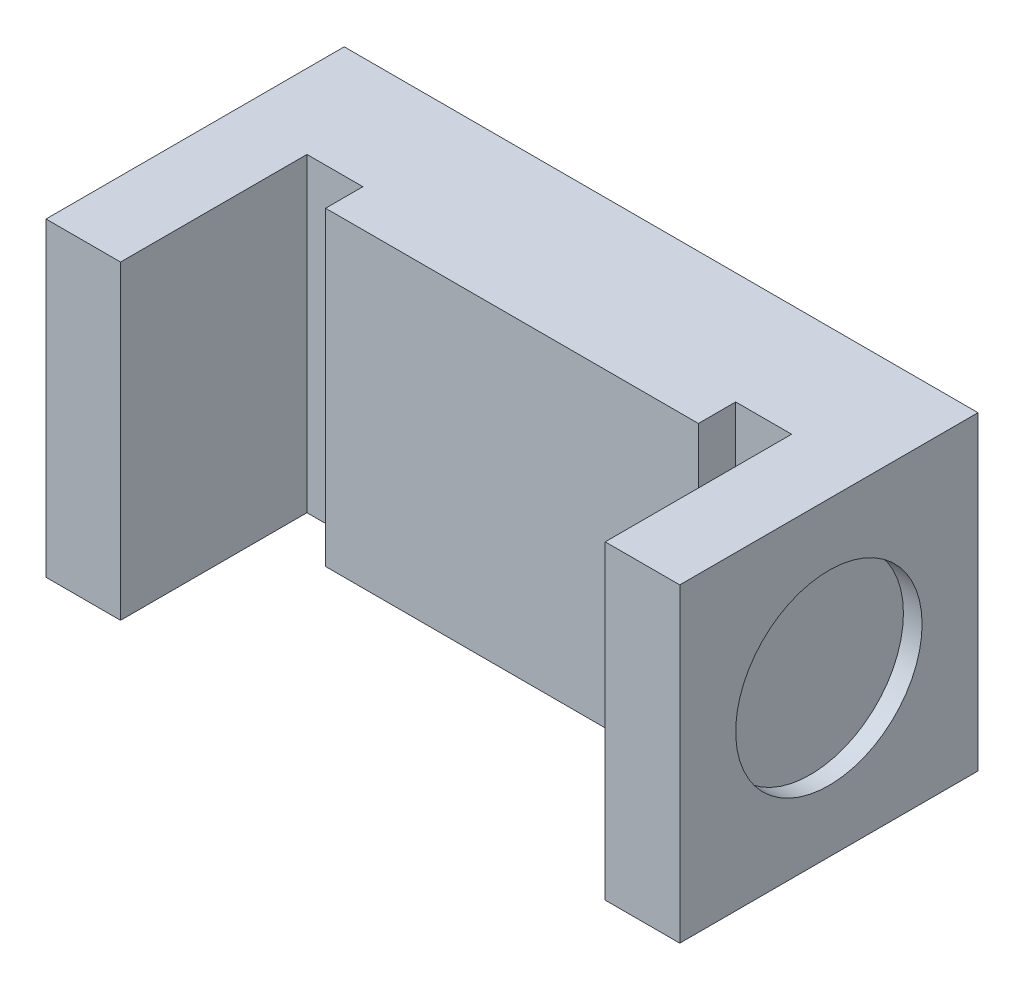
ISO-10303-21;
HEADER;
FILE_DESCRIPTION(('STEP AP214'),'2;1');
FILE_NAME('part.step','',(''),(''),'','','');
FILE_SCHEMA(('AUTOMOTIVE_DESIGN { 1 0 10303 214 1 1 1 1 }'));
ENDSEC;
DATA;
#1=APPLICATION_CONTEXT('core data for automotive mechanical design processes');
#2=APPLICATION_PROTOCOL_DEFINITION('international standard','automotive_design',2000,#1);
#3=PRODUCT_CONTEXT('',#1,'mechanical');
#4=PRODUCT('Part','Part','',(#3));
#5=PRODUCT_RELATED_PRODUCT_CATEGORY('part','',(#4));
#6=PRODUCT_DEFINITION_FORMATION('','',#4);
#7=PRODUCT_DEFINITION_CONTEXT('part definition',#1,'design');
#8=PRODUCT_DEFINITION('design','',#6,#7);
#9=PRODUCT_DEFINITION_SHAPE('','',#8);
#10=(LENGTH_UNIT() NAMED_UNIT(*) SI_UNIT(.MILLI.,.METRE.));
#11=(NAMED_UNIT(*) PLANE_ANGLE_UNIT() SI_UNIT($,.RADIAN.));
#12=(NAMED_UNIT(*) SI_UNIT($,.STERADIAN.) SOLID_ANGLE_UNIT());
#13=UNCERTAINTY_MEASURE_WITH_UNIT(LENGTH_MEASURE(1.E-05),#10,'distance_accuracy_value','');
#14=(GEOMETRIC_REPRESENTATION_CONTEXT(3) GLOBAL_UNCERTAINTY_ASSIGNED_CONTEXT((#13)) GLOBAL_UNIT_ASSIGNED_CONTEXT((#10,
#11,#12)) REPRESENTATION_CONTEXT('',''));
#15=CARTESIAN_POINT('',(0.,0.,0.));
#16=DIRECTION('',(0.,0.,1.));
#17=DIRECTION('',(1.,0.,0.));
#18=AXIS2_PLACEMENT_3D('',#15,#16,#17);
#19=CARTESIAN_POINT('',(42.5,25.,-30.));
#20=DIRECTION('',(0.,-1.,0.));
#21=DIRECTION('',(0.,0.,-1.));
#22=AXIS2_PLACEMENT_3D('',#19,#20,#21);
#23=PLANE('',#22);
#24=DIRECTION('',(1.,0.,0.));
#25=VECTOR('',#24,1.);
#26=CARTESIAN_POINT('',(42.5,25.,-15.));
#27=LINE('',#26,#25);
#28=CARTESIAN_POINT('',(-42.5,25.,-15.));
#29=VERTEX_POINT('',#28);
#30=CARTESIAN_POINT('',(42.5,25.,-15.));
#31=VERTEX_POINT('',#30);
#32=EDGE_CURVE('E231',#29,#31,#27,.T.);
#33=ORIENTED_EDGE('',*,*,#32,.F.);
#34=DIRECTION('',(0.,0.,1.));
#35=VECTOR('',#34,1.);
#36=CARTESIAN_POINT('',(-42.5,25.,-30.));
#37=LINE('',#36,#35);
#38=CARTESIAN_POINT('',(-42.5,25.,0.));
#39=VERTEX_POINT('',#38);
#40=EDGE_CURVE('E59',#29,#39,#37,.T.);
#41=ORIENTED_EDGE('',*,*,#40,.T.);
#42=DIRECTION('',(1.,0.,0.));
#43=VECTOR('',#42,1.);
#44=CARTESIAN_POINT('',(42.5,25.,0.));
#45=LINE('',#44,#43);
#46=CARTESIAN_POINT('',(42.5,25.,0.));
#47=VERTEX_POINT('',#46);
#48=EDGE_CURVE('E246',#39,#47,#45,.T.);
#49=ORIENTED_EDGE('',*,*,#48,.T.);
#50=DIRECTION('',(0.,0.,1.));
#51=VECTOR('',#50,1.);
#52=CARTESIAN_POINT('',(42.5,25.,-30.));
#53=LINE('',#52,#51);
#54=EDGE_CURVE('E256',#31,#47,#53,.T.);
#55=ORIENTED_EDGE('',*,*,#54,.F.);
#56=EDGE_LOOP('',(#33,#41,#49,#55));
#57=FACE_BOUND('',#56,.T.);
#58=ADVANCED_FACE('F33',(#57),#23,.F.);
#59=CARTESIAN_POINT('',(0.,0.,0.));
#60=DIRECTION('',(0.,0.,1.));
#61=DIRECTION('',(1.,0.,0.));
#62=AXIS2_PLACEMENT_3D('',#59,#60,#61);
#63=PLANE('',#62);
#64=DIRECTION('',(0.,1.,0.));
#65=VECTOR('',#64,1.);
#66=CARTESIAN_POINT('',(-40.,-31.6191983122362,0.));
#67=LINE('',#66,#65);
#68=CARTESIAN_POINT('',(-40.,-41.6191983122363,0.));
#69=VERTEX_POINT('',#68);
#70=CARTESIAN_POINT('',(-40.,-31.6191983122362,0.));
#71=VERTEX_POINT('',#70);
#72=EDGE_CURVE('E11',#69,#71,#67,.T.);
#73=ORIENTED_EDGE('',*,*,#72,.F.);
#74=DIRECTION('',(1.,0.,0.));
#75=VECTOR('',#74,1.);
#76=CARTESIAN_POINT('',(-65.,-41.6191983122363,0.));
#77=LINE('',#76,#75);
#78=CARTESIAN_POINT('',(-85.,-41.6191983122363,0.));
#79=VERTEX_POINT('',#78);
#80=EDGE_CURVE('E37',#79,#69,#77,.T.);
#81=ORIENTED_EDGE('',*,*,#80,.F.);
#82=DIRECTION('',(0.,-1.,0.));
#83=VECTOR('',#82,1.);
#84=CARTESIAN_POINT('',(-85.,41.6191983122363,0.));
#85=LINE('',#84,#83);
#86=CARTESIAN_POINT('',(-85.,41.6191983122363,0.));
#87=VERTEX_POINT('',#86);
#88=EDGE_CURVE('E326',#87,#79,#85,.T.);
#89=ORIENTED_EDGE('',*,*,#88,.F.);
#90=DIRECTION('',(-1.,0.,0.));
#91=VECTOR('',#90,1.);
#92=CARTESIAN_POINT('',(-65.,41.6191983122363,0.));
#93=LINE('',#92,#91);
#94=CARTESIAN_POINT('',(85.,41.6191983122363,0.));
#95=VERTEX_POINT('',#94);
#96=EDGE_CURVE('E375',#95,#87,#93,.T.);
#97=ORIENTED_EDGE('',*,*,#96,.F.);
#98=DIRECTION('',(0.,1.,0.));
#99=VECTOR('',#98,1.);
#100=CARTESIAN_POINT('',(85.,41.6191983122363,0.));
#101=LINE('',#100,#99);
#102=CARTESIAN_POINT('',(85.,-41.6191983122363,0.));
#103=VERTEX_POINT('',#102);
#104=EDGE_CURVE('E297',#103,#95,#101,.T.);
#105=ORIENTED_EDGE('',*,*,#104,.F.);
#106=CARTESIAN_POINT('',(40.,-41.6191983122363,0.));
#107=VERTEX_POINT('',#106);
#108=EDGE_CURVE('E386',#107,#103,#77,.T.);
#109=ORIENTED_EDGE('',*,*,#108,.F.);
#110=DIRECTION('',(0.,-1.,0.));
#111=VECTOR('',#110,1.);
#112=CARTESIAN_POINT('',(40.,-31.6191983122362,0.));
#113=LINE('',#112,#111);
#114=CARTESIAN_POINT('',(40.,-31.6191983122362,0.));
#115=VERTEX_POINT('',#114);
#116=EDGE_CURVE('E275',#115,#107,#113,.T.);
#117=ORIENTED_EDGE('',*,*,#116,.F.);
#118=DIRECTION('',(1.,0.,0.));
#119=VECTOR('',#118,1.);
#120=CARTESIAN_POINT('',(40.,-31.6191983122362,0.));
#121=LINE('',#120,#119);
#122=EDGE_CURVE('E271',#71,#115,#121,.T.);
#123=ORIENTED_EDGE('',*,*,#122,.F.);
#124=EDGE_LOOP('',(#73,#81,#89,#97,#105,#109,#117,#123));
#125=FACE_BOUND('',#124,.T.);
#126=DIRECTION('',(0.,1.,0.));
#127=VECTOR('',#126,1.);
#128=CARTESIAN_POINT('',(-42.5,25.,0.));
#129=LINE('',#128,#127);
#130=CARTESIAN_POINT('',(-42.5,-25.,0.));
#131=VERTEX_POINT('',#130);
#132=EDGE_CURVE('E237',#131,#39,#129,.T.);
#133=ORIENTED_EDGE('',*,*,#132,.F.);
#134=DIRECTION('',(-1.,0.,0.));
#135=VECTOR('',#134,1.);
#136=CARTESIAN_POINT('',(42.5,-25.,0.));
#137=LINE('',#136,#135);
#138=CARTESIAN_POINT('',(42.5,-25.,0.));
#139=VERTEX_POINT('',#138);
#140=EDGE_CURVE('E243',#139,#131,#137,.T.);
#141=ORIENTED_EDGE('',*,*,#140,.F.);
#142=DIRECTION('',(0.,-1.,0.));
#143=VECTOR('',#142,1.);
#144=CARTESIAN_POINT('',(42.5,25.,0.));
#145=LINE('',#144,#143);
#146=EDGE_CURVE('E248',#47,#139,#145,.T.);
#147=ORIENTED_EDGE('',*,*,#146,.F.);
#148=ORIENTED_EDGE('',*,*,#48,.F.);
#149=EDGE_LOOP('',(#133,#141,#147,#148));
#150=FACE_BOUND('',#149,.T.);
#151=ADVANCED_FACE('F419',(#125,#150),#63,.F.);
#152=CARTESIAN_POINT('',(0.,0.,30.));
#153=DIRECTION('',(0.,0.,1.));
#154=DIRECTION('',(1.,0.,0.));
#155=AXIS2_PLACEMENT_3D('',#152,#153,#154);
#156=PLANE('',#155);
#157=DIRECTION('',(0.,1.,0.));
#158=VECTOR('',#157,1.);
#159=CARTESIAN_POINT('',(50.,41.6191983122363,30.));
#160=LINE('',#159,#158);
#161=CARTESIAN_POINT('',(50.,-41.6191983122363,30.));
#162=VERTEX_POINT('',#161);
#163=CARTESIAN_POINT('',(50.,41.6191983122363,30.));
#164=VERTEX_POINT('',#163);
#165=EDGE_CURVE('E348',#162,#164,#160,.T.);
#166=ORIENTED_EDGE('',*,*,#165,.F.);
#167=DIRECTION('',(1.,0.,0.));
#168=VECTOR('',#167,1.);
#169=CARTESIAN_POINT('',(-65.,-41.6191983122363,30.));
#170=LINE('',#169,#168);
#171=CARTESIAN_POINT('',(65.,-41.6191983122363,30.));
#172=VERTEX_POINT('',#171);
#173=EDGE_CURVE('E385',#162,#172,#170,.T.);
#174=ORIENTED_EDGE('',*,*,#173,.T.);
#175=DIRECTION('',(0.,1.,0.));
#176=VECTOR('',#175,1.);
#177=CARTESIAN_POINT('',(65.,41.6191983122363,30.));
#178=LINE('',#177,#176);
#179=CARTESIAN_POINT('',(65.,41.6191983122363,30.));
#180=VERTEX_POINT('',#179);
#181=EDGE_CURVE('E376',#172,#180,#178,.T.);
#182=ORIENTED_EDGE('',*,*,#181,.T.);
#183=DIRECTION('',(-1.,0.,0.));
#184=VECTOR('',#183,1.);
#185=CARTESIAN_POINT('',(-65.,41.6191983122363,30.));
#186=LINE('',#185,#184);
#187=EDGE_CURVE('E380',#180,#164,#186,.T.);
#188=ORIENTED_EDGE('',*,*,#187,.T.);
#189=EDGE_LOOP('',(#166,#174,#182,#188));
#190=FACE_BOUND('',#189,.T.);
#191=ADVANCED_FACE('F441',(#190),#156,.T.);
#192=CARTESIAN_POINT('',(-65.,41.6191983122363,30.));
#193=DIRECTION('',(0.,-1.,0.));
#194=DIRECTION('',(0.,0.,-1.));
#195=AXIS2_PLACEMENT_3D('',#192,#193,#194);
#196=PLANE('',#195);
#197=ORIENTED_EDGE('',*,*,#96,.T.);
#198=DIRECTION('',(0.,0.,-1.));
#199=VECTOR('',#198,1.);
#200=CARTESIAN_POINT('',(-85.,41.6191983122363,0.));
#201=LINE('',#200,#199);
#202=CARTESIAN_POINT('',(-85.,41.6191983122363,80.));
#203=VERTEX_POINT('',#202);
#204=EDGE_CURVE('E334',#203,#87,#201,.T.);
#205=ORIENTED_EDGE('',*,*,#204,.F.);
#206=DIRECTION('',(1.,0.,0.));
#207=VECTOR('',#206,1.);
#208=CARTESIAN_POINT('',(-85.,41.6191983122363,80.));
#209=LINE('',#208,#207);
#210=CARTESIAN_POINT('',(-65.,41.6191983122363,80.));
#211=VERTEX_POINT('',#210);
#212=EDGE_CURVE('E337',#203,#211,#209,.T.);
#213=ORIENTED_EDGE('',*,*,#212,.T.);
#214=DIRECTION('',(0.,0.,-1.));
#215=VECTOR('',#214,1.);
#216=CARTESIAN_POINT('',(-65.,41.6191983122363,0.));
#217=LINE('',#216,#215);
#218=CARTESIAN_POINT('',(-65.,41.6191983122363,30.));
#219=VERTEX_POINT('',#218);
#220=EDGE_CURVE('E330',#211,#219,#217,.T.);
#221=ORIENTED_EDGE('',*,*,#220,.T.);
#222=CARTESIAN_POINT('',(-50.,41.6191983122363,30.));
#223=VERTEX_POINT('',#222);
#224=EDGE_CURVE('E379',#223,#219,#186,.T.);
#225=ORIENTED_EDGE('',*,*,#224,.F.);
#226=DIRECTION('',(0.,0.,-1.));
#227=VECTOR('',#226,1.);
#228=CARTESIAN_POINT('',(-50.,41.6191983122363,40.));
#229=LINE('',#228,#227);
#230=CARTESIAN_POINT('',(-50.,41.6191983122363,40.));
#231=VERTEX_POINT('',#230);
#232=EDGE_CURVE('E369',#231,#223,#229,.T.);
#233=ORIENTED_EDGE('',*,*,#232,.F.);
#234=DIRECTION('',(-1.,0.,0.));
#235=VECTOR('',#234,1.);
#236=CARTESIAN_POINT('',(-50.,41.6191983122363,40.));
#237=LINE('',#236,#235);
#238=CARTESIAN_POINT('',(50.,41.6191983122363,40.));
#239=VERTEX_POINT('',#238);
#240=EDGE_CURVE('E352',#239,#231,#237,.T.);
#241=ORIENTED_EDGE('',*,*,#240,.F.);
#242=DIRECTION('',(0.,0.,-1.));
#243=VECTOR('',#242,1.);
#244=CARTESIAN_POINT('',(50.,41.6191983122363,40.));
#245=LINE('',#244,#243);
#246=EDGE_CURVE('E372',#239,#164,#245,.T.);
#247=ORIENTED_EDGE('',*,*,#246,.T.);
#248=ORIENTED_EDGE('',*,*,#187,.F.);
#249=DIRECTION('',(0.,0.,1.));
#250=VECTOR('',#249,1.);
#251=CARTESIAN_POINT('',(65.,41.6191983122363,0.));
#252=LINE('',#251,#250);
#253=CARTESIAN_POINT('',(65.,41.6191983122363,80.));
#254=VERTEX_POINT('',#253);
#255=EDGE_CURVE('E294',#180,#254,#252,.T.);
#256=ORIENTED_EDGE('',*,*,#255,.T.);
#257=DIRECTION('',(-1.,0.,0.));
#258=VECTOR('',#257,1.);
#259=CARTESIAN_POINT('',(85.,41.6191983122363,80.));
#260=LINE('',#259,#258);
#261=CARTESIAN_POINT('',(85.,41.6191983122363,80.));
#262=VERTEX_POINT('',#261);
#263=EDGE_CURVE('E316',#262,#254,#260,.T.);
#264=ORIENTED_EDGE('',*,*,#263,.F.);
#265=DIRECTION('',(0.,0.,1.));
#266=VECTOR('',#265,1.);
#267=CARTESIAN_POINT('',(85.,41.6191983122363,0.));
#268=LINE('',#267,#266);
#269=EDGE_CURVE('E300',#95,#262,#268,.T.);
#270=ORIENTED_EDGE('',*,*,#269,.F.);
#271=EDGE_LOOP('',(#197,#205,#213,#221,#225,#233,#241,#247,#248,#256,#264,#270));
#272=FACE_BOUND('',#271,.T.);
#273=ADVANCED_FACE('F35',(#272),#196,.F.);
#274=CARTESIAN_POINT('',(-65.,-41.6191983122363,30.));
#275=DIRECTION('',(0.,1.,0.));
#276=DIRECTION('',(0.,0.,1.));
#277=AXIS2_PLACEMENT_3D('',#274,#275,#276);
#278=PLANE('',#277);
#279=ORIENTED_EDGE('',*,*,#80,.T.);
#280=EDGE_CURVE('E390',#69,#107,#77,.T.);
#281=ORIENTED_EDGE('',*,*,#280,.T.);
#282=ORIENTED_EDGE('',*,*,#108,.T.);
#283=DIRECTION('',(0.,0.,-1.));
#284=VECTOR('',#283,1.);
#285=CARTESIAN_POINT('',(85.,-41.6191983122363,0.));
#286=LINE('',#285,#284);
#287=CARTESIAN_POINT('',(85.,-41.6191983122363,80.));
#288=VERTEX_POINT('',#287);
#289=EDGE_CURVE('E305',#288,#103,#286,.T.);
#290=ORIENTED_EDGE('',*,*,#289,.F.);
#291=DIRECTION('',(-1.,0.,0.));
#292=VECTOR('',#291,1.);
#293=CARTESIAN_POINT('',(85.,-41.6191983122363,80.));
#294=LINE('',#293,#292);
#295=CARTESIAN_POINT('',(65.,-41.6191983122363,80.));
#296=VERTEX_POINT('',#295);
#297=EDGE_CURVE('E308',#288,#296,#294,.T.);
#298=ORIENTED_EDGE('',*,*,#297,.T.);
#299=DIRECTION('',(0.,0.,-1.));
#300=VECTOR('',#299,1.);
#301=CARTESIAN_POINT('',(65.,-41.6191983122363,0.));
#302=LINE('',#301,#300);
#303=EDGE_CURVE('E301',#296,#172,#302,.T.);
#304=ORIENTED_EDGE('',*,*,#303,.T.);
#305=ORIENTED_EDGE('',*,*,#173,.F.);
#306=DIRECTION('',(0.,0.,-1.));
#307=VECTOR('',#306,1.);
#308=CARTESIAN_POINT('',(50.,-41.6191983122363,40.));
#309=LINE('',#308,#307);
#310=CARTESIAN_POINT('',(50.,-41.6191983122363,40.));
#311=VERTEX_POINT('',#310);
#312=EDGE_CURVE('E359',#311,#162,#309,.T.);
#313=ORIENTED_EDGE('',*,*,#312,.F.);
#314=DIRECTION('',(1.,0.,0.));
#315=VECTOR('',#314,1.);
#316=CARTESIAN_POINT('',(-50.,-41.6191983122363,40.));
#317=LINE('',#316,#315);
#318=CARTESIAN_POINT('',(-50.,-41.6191983122363,40.));
#319=VERTEX_POINT('',#318);
#320=EDGE_CURVE('E357',#319,#311,#317,.T.);
#321=ORIENTED_EDGE('',*,*,#320,.F.);
#322=DIRECTION('',(0.,0.,-1.));
#323=VECTOR('',#322,1.);
#324=CARTESIAN_POINT('',(-50.,-41.6191983122363,40.));
#325=LINE('',#324,#323);
#326=CARTESIAN_POINT('',(-50.,-41.6191983122363,30.));
#327=VERTEX_POINT('',#326);
#328=EDGE_CURVE('E366',#319,#327,#325,.T.);
#329=ORIENTED_EDGE('',*,*,#328,.T.);
#330=CARTESIAN_POINT('',(-65.,-41.6191983122363,30.));
#331=VERTEX_POINT('',#330);
#332=EDGE_CURVE('E42',#331,#327,#170,.T.);
#333=ORIENTED_EDGE('',*,*,#332,.F.);
#334=DIRECTION('',(0.,0.,1.));
#335=VECTOR('',#334,1.);
#336=CARTESIAN_POINT('',(-65.,-41.6191983122363,0.));
#337=LINE('',#336,#335);
#338=CARTESIAN_POINT('',(-65.,-41.6191983122363,80.));
#339=VERTEX_POINT('',#338);
#340=EDGE_CURVE('E323',#331,#339,#337,.T.);
#341=ORIENTED_EDGE('',*,*,#340,.T.);
#342=DIRECTION('',(1.,0.,0.));
#343=VECTOR('',#342,1.);
#344=CARTESIAN_POINT('',(-85.,-41.6191983122363,80.));
#345=LINE('',#344,#343);
#346=CARTESIAN_POINT('',(-85.,-41.6191983122363,80.));
#347=VERTEX_POINT('',#346);
#348=EDGE_CURVE('E345',#347,#339,#345,.T.);
#349=ORIENTED_EDGE('',*,*,#348,.F.);
#350=DIRECTION('',(0.,0.,1.));
#351=VECTOR('',#350,1.);
#352=CARTESIAN_POINT('',(-85.,-41.6191983122363,0.));
#353=LINE('',#352,#351);
#354=EDGE_CURVE('E329',#79,#347,#353,.T.);
#355=ORIENTED_EDGE('',*,*,#354,.F.);
#356=EDGE_LOOP('',(#279,#281,#282,#290,#298,#304,#305,#313,#321,#329,#333,#341,#349,#355));
#357=FACE_BOUND('',#356,.T.);
#358=ADVANCED_FACE('F397',(#357),#278,.F.);
#359=DIRECTION('',(0.,-1.,0.));
#360=VECTOR('',#359,1.);
#361=CARTESIAN_POINT('',(-50.,41.6191983122363,30.));
#362=LINE('',#361,#360);
#363=EDGE_CURVE('E353',#223,#327,#362,.T.);
#364=ORIENTED_EDGE('',*,*,#363,.F.);
#365=ORIENTED_EDGE('',*,*,#224,.T.);
#366=DIRECTION('',(0.,-1.,0.));
#367=VECTOR('',#366,1.);
#368=CARTESIAN_POINT('',(-65.,41.6191983122363,30.));
#369=LINE('',#368,#367);
#370=EDGE_CURVE('E382',#219,#331,#369,.T.);
#371=ORIENTED_EDGE('',*,*,#370,.T.);
#372=ORIENTED_EDGE('',*,*,#332,.T.);
#373=EDGE_LOOP('',(#364,#365,#371,#372));
#374=FACE_BOUND('',#373,.T.);
#375=ADVANCED_FACE('F605',(#374),#156,.T.);
#376=CARTESIAN_POINT('',(50.,41.6191983122363,40.));
#377=DIRECTION('',(-1.,0.,0.));
#378=DIRECTION('',(0.,0.,1.));
#379=AXIS2_PLACEMENT_3D('',#376,#377,#378);
#380=PLANE('',#379);
#381=ORIENTED_EDGE('',*,*,#165,.T.);
#382=ORIENTED_EDGE('',*,*,#246,.F.);
#383=DIRECTION('',(0.,1.,0.));
#384=VECTOR('',#383,1.);
#385=CARTESIAN_POINT('',(50.,41.6191983122363,40.));
#386=LINE('',#385,#384);
#387=EDGE_CURVE('E349',#311,#239,#386,.T.);
#388=ORIENTED_EDGE('',*,*,#387,.F.);
#389=ORIENTED_EDGE('',*,*,#312,.T.);
#390=EDGE_LOOP('',(#381,#382,#388,#389));
#391=FACE_BOUND('',#390,.T.);
#392=ADVANCED_FACE('F730',(#391),#380,.F.);
#393=CARTESIAN_POINT('',(-50.,41.6191983122363,40.));
#394=DIRECTION('',(1.,0.,0.));
#395=DIRECTION('',(0.,0.,-1.));
#396=AXIS2_PLACEMENT_3D('',#393,#394,#395);
#397=PLANE('',#396);
#398=ORIENTED_EDGE('',*,*,#363,.T.);
#399=ORIENTED_EDGE('',*,*,#328,.F.);
#400=DIRECTION('',(0.,-1.,0.));
#401=VECTOR('',#400,1.);
#402=CARTESIAN_POINT('',(-50.,41.6191983122363,40.));
#403=LINE('',#402,#401);
#404=EDGE_CURVE('E355',#231,#319,#403,.T.);
#405=ORIENTED_EDGE('',*,*,#404,.F.);
#406=ORIENTED_EDGE('',*,*,#232,.T.);
#407=EDGE_LOOP('',(#398,#399,#405,#406));
#408=FACE_BOUND('',#407,.T.);
#409=ADVANCED_FACE('F740',(#408),#397,.F.);
#410=CARTESIAN_POINT('',(0.,0.,40.));
#411=DIRECTION('',(0.,0.,1.));
#412=DIRECTION('',(1.,0.,0.));
#413=AXIS2_PLACEMENT_3D('',#410,#411,#412);
#414=PLANE('',#413);
#415=ORIENTED_EDGE('',*,*,#387,.T.);
#416=ORIENTED_EDGE('',*,*,#240,.T.);
#417=ORIENTED_EDGE('',*,*,#404,.T.);
#418=ORIENTED_EDGE('',*,*,#320,.T.);
#419=EDGE_LOOP('',(#415,#416,#417,#418));
#420=FACE_BOUND('',#419,.T.);
#421=ADVANCED_FACE('F721',(#420),#414,.T.);
#422=CARTESIAN_POINT('',(-85.,41.6191983122363,80.));
#423=DIRECTION('',(0.,0.,-1.));
#424=DIRECTION('',(-1.,0.,0.));
#425=AXIS2_PLACEMENT_3D('',#422,#423,#424);
#426=PLANE('',#425);
#427=DIRECTION('',(0.,1.,0.));
#428=VECTOR('',#427,1.);
#429=CARTESIAN_POINT('',(-65.,41.6191983122363,80.));
#430=LINE('',#429,#428);
#431=EDGE_CURVE('E339',#339,#211,#430,.T.);
#432=ORIENTED_EDGE('',*,*,#431,.T.);
#433=ORIENTED_EDGE('',*,*,#212,.F.);
#434=DIRECTION('',(0.,1.,0.));
#435=VECTOR('',#434,1.);
#436=CARTESIAN_POINT('',(-85.,41.6191983122363,80.));
#437=LINE('',#436,#435);
#438=EDGE_CURVE('E332',#347,#203,#437,.T.);
#439=ORIENTED_EDGE('',*,*,#438,.F.);
#440=ORIENTED_EDGE('',*,*,#348,.T.);
#441=EDGE_LOOP('',(#432,#433,#439,#440));
#442=FACE_BOUND('',#441,.T.);
#443=ADVANCED_FACE('F704',(#442),#426,.F.);
#444=CARTESIAN_POINT('',(-85.,0.,0.));
#445=DIRECTION('',(-1.,0.,0.));
#446=DIRECTION('',(0.,0.,1.));
#447=AXIS2_PLACEMENT_3D('',#444,#445,#446);
#448=PLANE('',#447);
#449=CARTESIAN_POINT('',(-85.,0.,40.));
#450=DIRECTION('',(-1.,0.,0.));
#451=DIRECTION('',(0.,0.,1.));
#452=AXIS2_PLACEMENT_3D('',#449,#450,#451);
#453=CIRCLE('',#452,25.);
#454=CARTESIAN_POINT('',(-85.,0.,65.));
#455=VERTEX_POINT('',#454);
#456=EDGE_CURVE('E319',#455,#455,#453,.T.);
#457=ORIENTED_EDGE('',*,*,#456,.F.);
#458=EDGE_LOOP('',(#457));
#459=FACE_BOUND('',#458,.T.);
#460=ORIENTED_EDGE('',*,*,#88,.T.);
#461=ORIENTED_EDGE('',*,*,#354,.T.);
#462=ORIENTED_EDGE('',*,*,#438,.T.);
#463=ORIENTED_EDGE('',*,*,#204,.T.);
#464=EDGE_LOOP('',(#460,#461,#462,#463));
#465=FACE_BOUND('',#464,.T.);
#466=ADVANCED_FACE('F699',(#459,#465),#448,.T.);
#467=CARTESIAN_POINT('',(-65.,0.,0.));
#468=DIRECTION('',(-1.,0.,0.));
#469=DIRECTION('',(0.,0.,1.));
#470=AXIS2_PLACEMENT_3D('',#467,#468,#469);
#471=PLANE('',#470);
#472=ORIENTED_EDGE('',*,*,#370,.F.);
#473=ORIENTED_EDGE('',*,*,#220,.F.);
#474=ORIENTED_EDGE('',*,*,#431,.F.);
#475=ORIENTED_EDGE('',*,*,#340,.F.);
#476=EDGE_LOOP('',(#472,#473,#474,#475));
#477=FACE_BOUND('',#476,.T.);
#478=ADVANCED_FACE('F691',(#477),#471,.F.);
#479=CARTESIAN_POINT('',(-80.,0.,40.));
#480=DIRECTION('',(-1.,0.,0.));
#481=DIRECTION('',(0.,0.,1.));
#482=AXIS2_PLACEMENT_3D('',#479,#480,#481);
#483=CYLINDRICAL_SURFACE('',#482,25.);
#484=CARTESIAN_POINT('',(-80.,0.,40.));
#485=DIRECTION('',(-1.,0.,0.));
#486=DIRECTION('',(0.,0.,1.));
#487=AXIS2_PLACEMENT_3D('',#484,#485,#486);
#488=CIRCLE('',#487,25.);
#489=CARTESIAN_POINT('',(-80.,0.,65.));
#490=VERTEX_POINT('',#489);
#491=EDGE_CURVE('E320',#490,#490,#488,.T.);
#492=ORIENTED_EDGE('',*,*,#491,.F.);
#493=EDGE_LOOP('',(#492));
#494=FACE_BOUND('',#493,.T.);
#495=ORIENTED_EDGE('',*,*,#456,.T.);
#496=EDGE_LOOP('',(#495));
#497=FACE_BOUND('',#496,.T.);
#498=ADVANCED_FACE('F681',(#494,#497),#483,.F.);
#499=CARTESIAN_POINT('',(-80.,0.,40.));
#500=DIRECTION('',(-1.,0.,0.));
#501=DIRECTION('',(0.,0.,1.));
#502=AXIS2_PLACEMENT_3D('',#499,#500,#501);
#503=PLANE('',#502);
#504=ORIENTED_EDGE('',*,*,#491,.T.);
#505=EDGE_LOOP('',(#504));
#506=FACE_BOUND('',#505,.T.);
#507=ADVANCED_FACE('F655',(#506),#503,.T.);
#508=CARTESIAN_POINT('',(65.,0.,0.));
#509=DIRECTION('',(-1.,0.,0.));
#510=DIRECTION('',(0.,0.,1.));
#511=AXIS2_PLACEMENT_3D('',#508,#509,#510);
#512=PLANE('',#511);
#513=ORIENTED_EDGE('',*,*,#181,.F.);
#514=ORIENTED_EDGE('',*,*,#303,.F.);
#515=DIRECTION('',(0.,-1.,0.));
#516=VECTOR('',#515,1.);
#517=CARTESIAN_POINT('',(65.,41.6191983122363,80.));
#518=LINE('',#517,#516);
#519=EDGE_CURVE('E310',#254,#296,#518,.T.);
#520=ORIENTED_EDGE('',*,*,#519,.F.);
#521=ORIENTED_EDGE('',*,*,#255,.F.);
#522=EDGE_LOOP('',(#513,#514,#520,#521));
#523=FACE_BOUND('',#522,.T.);
#524=ADVANCED_FACE('F646',(#523),#512,.T.);
#525=CARTESIAN_POINT('',(85.,41.6191983122363,80.));
#526=DIRECTION('',(0.,0.,-1.));
#527=DIRECTION('',(0.,1.,0.));
#528=AXIS2_PLACEMENT_3D('',#525,#526,#527);
#529=PLANE('',#528);
#530=ORIENTED_EDGE('',*,*,#519,.T.);
#531=ORIENTED_EDGE('',*,*,#297,.F.);
#532=DIRECTION('',(0.,-1.,0.));
#533=VECTOR('',#532,1.);
#534=CARTESIAN_POINT('',(85.,41.6191983122363,80.));
#535=LINE('',#534,#533);
#536=EDGE_CURVE('E303',#262,#288,#535,.T.);
#537=ORIENTED_EDGE('',*,*,#536,.F.);
#538=ORIENTED_EDGE('',*,*,#263,.T.);
#539=EDGE_LOOP('',(#530,#531,#537,#538));
#540=FACE_BOUND('',#539,.T.);
#541=ADVANCED_FACE('F636',(#540),#529,.F.);
#542=CARTESIAN_POINT('',(85.,0.,0.));
#543=DIRECTION('',(-1.,0.,0.));
#544=DIRECTION('',(0.,0.,1.));
#545=AXIS2_PLACEMENT_3D('',#542,#543,#544);
#546=PLANE('',#545);
#547=CARTESIAN_POINT('',(85.,0.,40.));
#548=DIRECTION('',(1.,0.,0.));
#549=DIRECTION('',(0.,0.,-1.));
#550=AXIS2_PLACEMENT_3D('',#547,#548,#549);
#551=CIRCLE('',#550,25.);
#552=CARTESIAN_POINT('',(85.,0.,15.));
#553=VERTEX_POINT('',#552);
#554=EDGE_CURVE('E290',#553,#553,#551,.T.);
#555=ORIENTED_EDGE('',*,*,#554,.F.);
#556=EDGE_LOOP('',(#555));
#557=FACE_BOUND('',#556,.T.);
#558=ORIENTED_EDGE('',*,*,#104,.T.);
#559=ORIENTED_EDGE('',*,*,#269,.T.);
#560=ORIENTED_EDGE('',*,*,#536,.T.);
#561=ORIENTED_EDGE('',*,*,#289,.T.);
#562=EDGE_LOOP('',(#558,#559,#560,#561));
#563=FACE_BOUND('',#562,.T.);
#564=ADVANCED_FACE('F626',(#557,#563),#546,.F.);
#565=CARTESIAN_POINT('',(80.,0.,40.));
#566=DIRECTION('',(1.,0.,0.));
#567=DIRECTION('',(0.,0.,-1.));
#568=AXIS2_PLACEMENT_3D('',#565,#566,#567);
#569=CYLINDRICAL_SURFACE('',#568,25.);
#570=CARTESIAN_POINT('',(80.,0.,40.));
#571=DIRECTION('',(1.,0.,0.));
#572=DIRECTION('',(0.,0.,-1.));
#573=AXIS2_PLACEMENT_3D('',#570,#571,#572);
#574=CIRCLE('',#573,25.);
#575=CARTESIAN_POINT('',(80.,0.,15.));
#576=VERTEX_POINT('',#575);
#577=EDGE_CURVE('E291',#576,#576,#574,.T.);
#578=ORIENTED_EDGE('',*,*,#577,.F.);
#579=EDGE_LOOP('',(#578));
#580=FACE_BOUND('',#579,.T.);
#581=ORIENTED_EDGE('',*,*,#554,.T.);
#582=EDGE_LOOP('',(#581));
#583=FACE_BOUND('',#582,.T.);
#584=ADVANCED_FACE('F616',(#580,#583),#569,.F.);
#585=CARTESIAN_POINT('',(80.,0.,40.));
#586=DIRECTION('',(1.,0.,0.));
#587=DIRECTION('',(0.,0.,-1.));
#588=AXIS2_PLACEMENT_3D('',#585,#586,#587);
#589=PLANE('',#588);
#590=ORIENTED_EDGE('',*,*,#577,.T.);
#591=EDGE_LOOP('',(#590));
#592=FACE_BOUND('',#591,.T.);
#593=ADVANCED_FACE('F594',(#592),#589,.T.);
#594=CARTESIAN_POINT('',(-40.,-31.6191983122362,-5.));
#595=DIRECTION('',(1.,0.,0.));
#596=DIRECTION('',(0.,0.,-1.));
#597=AXIS2_PLACEMENT_3D('',#594,#595,#596);
#598=PLANE('',#597);
#599=CARTESIAN_POINT('',(-40.,-51.6191983122362,0.));
#600=VERTEX_POINT('',#599);
#601=EDGE_CURVE('E44',#600,#69,#67,.T.);
#602=ORIENTED_EDGE('',*,*,#601,.T.);
#603=ORIENTED_EDGE('',*,*,#72,.T.);
#604=DIRECTION('',(0.,0.,1.));
#605=VECTOR('',#604,1.);
#606=CARTESIAN_POINT('',(-40.,-31.6191983122362,-5.));
#607=LINE('',#606,#605);
#608=CARTESIAN_POINT('',(-40.,-31.6191983122362,-5.));
#609=VERTEX_POINT('',#608);
#610=EDGE_CURVE('E287',#609,#71,#607,.T.);
#611=ORIENTED_EDGE('',*,*,#610,.F.);
#612=DIRECTION('',(0.,1.,0.));
#613=VECTOR('',#612,1.);
#614=CARTESIAN_POINT('',(-40.,-31.6191983122362,-5.));
#615=LINE('',#614,#613);
#616=CARTESIAN_POINT('',(-40.,-51.6191983122362,-5.));
#617=VERTEX_POINT('',#616);
#618=EDGE_CURVE('E259',#617,#609,#615,.T.);
#619=ORIENTED_EDGE('',*,*,#618,.F.);
#620=DIRECTION('',(0.,0.,1.));
#621=VECTOR('',#620,1.);
#622=CARTESIAN_POINT('',(-40.,-51.6191983122362,-5.));
#623=LINE('',#622,#621);
#624=EDGE_CURVE('E268',#617,#600,#623,.T.);
#625=ORIENTED_EDGE('',*,*,#624,.T.);
#626=EDGE_LOOP('',(#602,#603,#611,#619,#625));
#627=FACE_BOUND('',#626,.T.);
#628=ADVANCED_FACE('F407',(#627),#598,.F.);
#629=CARTESIAN_POINT('',(40.,-31.6191983122362,-5.));
#630=DIRECTION('',(0.,-1.,0.));
#631=DIRECTION('',(0.,0.,-1.));
#632=AXIS2_PLACEMENT_3D('',#629,#630,#631);
#633=PLANE('',#632);
#634=ORIENTED_EDGE('',*,*,#122,.T.);
#635=DIRECTION('',(0.,0.,1.));
#636=VECTOR('',#635,1.);
#637=CARTESIAN_POINT('',(40.,-31.6191983122362,-5.));
#638=LINE('',#637,#636);
#639=CARTESIAN_POINT('',(40.,-31.6191983122362,-5.));
#640=VERTEX_POINT('',#639);
#641=EDGE_CURVE('E284',#640,#115,#638,.T.);
#642=ORIENTED_EDGE('',*,*,#641,.F.);
#643=DIRECTION('',(1.,0.,0.));
#644=VECTOR('',#643,1.);
#645=CARTESIAN_POINT('',(40.,-31.6191983122362,-5.));
#646=LINE('',#645,#644);
#647=EDGE_CURVE('E262',#609,#640,#646,.T.);
#648=ORIENTED_EDGE('',*,*,#647,.F.);
#649=ORIENTED_EDGE('',*,*,#610,.T.);
#650=EDGE_LOOP('',(#634,#642,#648,#649));
#651=FACE_BOUND('',#650,.T.);
#652=ADVANCED_FACE('F423',(#651),#633,.F.);
#653=CARTESIAN_POINT('',(40.,-31.6191983122362,-5.));
#654=DIRECTION('',(-1.,0.,0.));
#655=DIRECTION('',(0.,0.,1.));
#656=AXIS2_PLACEMENT_3D('',#653,#654,#655);
#657=PLANE('',#656);
#658=ORIENTED_EDGE('',*,*,#116,.T.);
#659=CARTESIAN_POINT('',(40.,-51.6191983122362,0.));
#660=VERTEX_POINT('',#659);
#661=EDGE_CURVE('E274',#107,#660,#113,.T.);
#662=ORIENTED_EDGE('',*,*,#661,.T.);
#663=DIRECTION('',(0.,0.,1.));
#664=VECTOR('',#663,1.);
#665=CARTESIAN_POINT('',(40.,-51.6191983122362,-5.));
#666=LINE('',#665,#664);
#667=CARTESIAN_POINT('',(40.,-51.6191983122362,-5.));
#668=VERTEX_POINT('',#667);
#669=EDGE_CURVE('E281',#668,#660,#666,.T.);
#670=ORIENTED_EDGE('',*,*,#669,.F.);
#671=DIRECTION('',(0.,-1.,0.));
#672=VECTOR('',#671,1.);
#673=CARTESIAN_POINT('',(40.,-31.6191983122362,-5.));
#674=LINE('',#673,#672);
#675=EDGE_CURVE('E265',#640,#668,#674,.T.);
#676=ORIENTED_EDGE('',*,*,#675,.F.);
#677=ORIENTED_EDGE('',*,*,#641,.T.);
#678=EDGE_LOOP('',(#658,#662,#670,#676,#677));
#679=FACE_BOUND('',#678,.T.);
#680=ADVANCED_FACE('F417',(#679),#657,.F.);
#681=CARTESIAN_POINT('',(40.,-51.6191983122362,-5.));
#682=DIRECTION('',(0.,1.,0.));
#683=DIRECTION('',(0.,0.,1.));
#684=AXIS2_PLACEMENT_3D('',#681,#682,#683);
#685=PLANE('',#684);
#686=DIRECTION('',(-1.,0.,0.));
#687=VECTOR('',#686,1.);
#688=CARTESIAN_POINT('',(40.,-51.6191983122362,0.));
#689=LINE('',#688,#687);
#690=EDGE_CURVE('E263',#660,#600,#689,.T.);
#691=ORIENTED_EDGE('',*,*,#690,.T.);
#692=ORIENTED_EDGE('',*,*,#624,.F.);
#693=DIRECTION('',(-1.,0.,0.));
#694=VECTOR('',#693,1.);
#695=CARTESIAN_POINT('',(40.,-51.6191983122362,-5.));
#696=LINE('',#695,#694);
#697=EDGE_CURVE('E267',#668,#617,#696,.T.);
#698=ORIENTED_EDGE('',*,*,#697,.F.);
#699=ORIENTED_EDGE('',*,*,#669,.T.);
#700=EDGE_LOOP('',(#691,#692,#698,#699));
#701=FACE_BOUND('',#700,.T.);
#702=ADVANCED_FACE('F413',(#701),#685,.F.);
#703=CARTESIAN_POINT('',(0.,0.,-5.));
#704=DIRECTION('',(0.,0.,-1.));
#705=DIRECTION('',(-1.,0.,0.));
#706=AXIS2_PLACEMENT_3D('',#703,#704,#705);
#707=PLANE('',#706);
#708=ORIENTED_EDGE('',*,*,#618,.T.);
#709=ORIENTED_EDGE('',*,*,#647,.T.);
#710=ORIENTED_EDGE('',*,*,#675,.T.);
#711=ORIENTED_EDGE('',*,*,#697,.T.);
#712=EDGE_LOOP('',(#708,#709,#710,#711));
#713=FACE_BOUND('',#712,.T.);
#714=ADVANCED_FACE('F425',(#713),#707,.T.);
#715=CARTESIAN_POINT('',(0.,0.,0.));
#716=DIRECTION('',(0.,0.,-1.));
#717=DIRECTION('',(-1.,0.,0.));
#718=AXIS2_PLACEMENT_3D('',#715,#716,#717);
#719=PLANE('',#718);
#720=ORIENTED_EDGE('',*,*,#280,.F.);
#721=ORIENTED_EDGE('',*,*,#601,.F.);
#722=ORIENTED_EDGE('',*,*,#690,.F.);
#723=ORIENTED_EDGE('',*,*,#661,.F.);
#724=EDGE_LOOP('',(#720,#721,#722,#723));
#725=FACE_BOUND('',#724,.T.);
#726=ADVANCED_FACE('F404',(#725),#719,.F.);
#727=CARTESIAN_POINT('',(-42.5,25.,-30.));
#728=DIRECTION('',(1.,0.,0.));
#729=DIRECTION('',(0.,0.,-1.));
#730=AXIS2_PLACEMENT_3D('',#727,#728,#729);
#731=PLANE('',#730);
#732=DIRECTION('',(0.,1.,0.));
#733=VECTOR('',#732,1.);
#734=CARTESIAN_POINT('',(-42.5,25.,-15.));
#735=LINE('',#734,#733);
#736=CARTESIAN_POINT('',(-42.5,-25.,-15.));
#737=VERTEX_POINT('',#736);
#738=EDGE_CURVE('E228',#737,#29,#735,.T.);
#739=ORIENTED_EDGE('',*,*,#738,.F.);
#740=DIRECTION('',(0.,0.,1.));
#741=VECTOR('',#740,1.);
#742=CARTESIAN_POINT('',(-42.5,-25.,-30.));
#743=LINE('',#742,#741);
#744=EDGE_CURVE('E242',#737,#131,#743,.T.);
#745=ORIENTED_EDGE('',*,*,#744,.T.);
#746=ORIENTED_EDGE('',*,*,#132,.T.);
#747=ORIENTED_EDGE('',*,*,#40,.F.);
#748=EDGE_LOOP('',(#739,#745,#746,#747));
#749=FACE_BOUND('',#748,.T.);
#750=ADVANCED_FACE('F432',(#749),#731,.F.);
#751=CARTESIAN_POINT('',(42.5,25.,-30.));
#752=DIRECTION('',(-1.,0.,0.));
#753=DIRECTION('',(0.,-1.,0.));
#754=AXIS2_PLACEMENT_3D('',#751,#752,#753);
#755=PLANE('',#754);
#756=DIRECTION('',(0.,0.,1.));
#757=VECTOR('',#756,1.);
#758=CARTESIAN_POINT('',(42.5,-25.,-30.));
#759=LINE('',#758,#757);
#760=CARTESIAN_POINT('',(42.5,-25.,-15.));
#761=VERTEX_POINT('',#760);
#762=EDGE_CURVE('E254',#761,#139,#759,.T.);
#763=ORIENTED_EDGE('',*,*,#762,.F.);
#764=DIRECTION('',(0.,-1.,0.));
#765=VECTOR('',#764,1.);
#766=CARTESIAN_POINT('',(42.5,25.,-15.));
#767=LINE('',#766,#765);
#768=EDGE_CURVE('E229',#31,#761,#767,.T.);
#769=ORIENTED_EDGE('',*,*,#768,.F.);
#770=ORIENTED_EDGE('',*,*,#54,.T.);
#771=ORIENTED_EDGE('',*,*,#146,.T.);
#772=EDGE_LOOP('',(#763,#769,#770,#771));
#773=FACE_BOUND('',#772,.T.);
#774=ADVANCED_FACE('F444',(#773),#755,.F.);
#775=CARTESIAN_POINT('',(42.5,-25.,-30.));
#776=DIRECTION('',(0.,1.,0.));
#777=DIRECTION('',(0.,0.,1.));
#778=AXIS2_PLACEMENT_3D('',#775,#776,#777);
#779=PLANE('',#778);
#780=DIRECTION('',(1.,0.,0.));
#781=VECTOR('',#780,1.);
#782=CARTESIAN_POINT('',(42.5,-25.,-15.));
#783=LINE('',#782,#781);
#784=CARTESIAN_POINT('',(-12.5,-25.,-15.));
#785=VERTEX_POINT('',#784);
#786=EDGE_CURVE('E455',#737,#785,#783,.T.);
#787=ORIENTED_EDGE('',*,*,#786,.T.);
#788=DIRECTION('',(0.,0.,-1.));
#789=VECTOR('',#788,1.);
#790=CARTESIAN_POINT('',(-12.5,-25.,-30.));
#791=LINE('',#790,#789);
#792=CARTESIAN_POINT('',(-12.5,-25.,-30.));
#793=VERTEX_POINT('',#792);
#794=EDGE_CURVE('E211',#785,#793,#791,.T.);
#795=ORIENTED_EDGE('',*,*,#794,.T.);
#796=DIRECTION('',(-1.,0.,0.));
#797=VECTOR('',#796,1.);
#798=CARTESIAN_POINT('',(42.5,-25.,-30.));
#799=LINE('',#798,#797);
#800=CARTESIAN_POINT('',(12.5,-25.,-30.));
#801=VERTEX_POINT('',#800);
#802=EDGE_CURVE('E239',#801,#793,#799,.T.);
#803=ORIENTED_EDGE('',*,*,#802,.F.);
#804=DIRECTION('',(0.,0.,1.));
#805=VECTOR('',#804,1.);
#806=CARTESIAN_POINT('',(12.5,-25.,-30.));
#807=LINE('',#806,#805);
#808=CARTESIAN_POINT('',(12.5,-25.,-15.));
#809=VERTEX_POINT('',#808);
#810=EDGE_CURVE('E467',#801,#809,#807,.T.);
#811=ORIENTED_EDGE('',*,*,#810,.T.);
#812=DIRECTION('',(1.,0.,0.));
#813=VECTOR('',#812,1.);
#814=CARTESIAN_POINT('',(42.5,-25.,-15.));
#815=LINE('',#814,#813);
#816=EDGE_CURVE('E457',#809,#761,#815,.T.);
#817=ORIENTED_EDGE('',*,*,#816,.T.);
#818=ORIENTED_EDGE('',*,*,#762,.T.);
#819=ORIENTED_EDGE('',*,*,#140,.T.);
#820=ORIENTED_EDGE('',*,*,#744,.F.);
#821=EDGE_LOOP('',(#787,#795,#803,#811,#817,#818,#819,#820));
#822=FACE_BOUND('',#821,.T.);
#823=ADVANCED_FACE('F451',(#822),#779,.F.);
#824=CARTESIAN_POINT('',(0.,0.,-30.));
#825=DIRECTION('',(0.,0.,-1.));
#826=DIRECTION('',(-1.,0.,0.));
#827=AXIS2_PLACEMENT_3D('',#824,#825,#826);
#828=PLANE('',#827);
#829=DIRECTION('',(0.,1.,0.));
#830=VECTOR('',#829,1.);
#831=CARTESIAN_POINT('',(-12.5,-51.6191983122362,-30.));
#832=LINE('',#831,#830);
#833=CARTESIAN_POINT('',(-12.5,0.,-30.));
#834=VERTEX_POINT('',#833);
#835=EDGE_CURVE('E216',#793,#834,#832,.T.);
#836=ORIENTED_EDGE('',*,*,#835,.T.);
#837=DIRECTION('',(-1.,0.,0.));
#838=VECTOR('',#837,1.);
#839=CARTESIAN_POINT('',(42.5,0.,-30.));
#840=LINE('',#839,#838);
#841=CARTESIAN_POINT('',(12.5,0.,-30.));
#842=VERTEX_POINT('',#841);
#843=EDGE_CURVE('E224',#842,#834,#840,.T.);
#844=ORIENTED_EDGE('',*,*,#843,.F.);
#845=DIRECTION('',(0.,1.,0.));
#846=VECTOR('',#845,1.);
#847=CARTESIAN_POINT('',(12.5,-51.6191983122362,-30.));
#848=LINE('',#847,#846);
#849=EDGE_CURVE('E474',#801,#842,#848,.T.);
#850=ORIENTED_EDGE('',*,*,#849,.F.);
#851=ORIENTED_EDGE('',*,*,#802,.T.);
#852=EDGE_LOOP('',(#836,#844,#850,#851));
#853=FACE_BOUND('',#852,.T.);
#854=ADVANCED_FACE('F473',(#853),#828,.T.);
#855=CARTESIAN_POINT('',(42.5,0.,-15.));
#856=DIRECTION('',(0.,-1.,0.));
#857=DIRECTION('',(0.,0.,-1.));
#858=AXIS2_PLACEMENT_3D('',#855,#856,#857);
#859=PLANE('',#858);
#860=ORIENTED_EDGE('',*,*,#843,.T.);
#861=DIRECTION('',(0.,0.,-1.));
#862=VECTOR('',#861,1.);
#863=CARTESIAN_POINT('',(-12.5,0.,-30.));
#864=LINE('',#863,#862);
#865=CARTESIAN_POINT('',(-12.5,0.,-15.));
#866=VERTEX_POINT('',#865);
#867=EDGE_CURVE('E208',#866,#834,#864,.T.);
#868=ORIENTED_EDGE('',*,*,#867,.F.);
#869=DIRECTION('',(-1.,0.,0.));
#870=VECTOR('',#869,1.);
#871=CARTESIAN_POINT('',(42.5,0.,-15.));
#872=LINE('',#871,#870);
#873=CARTESIAN_POINT('',(12.5,0.,-15.));
#874=VERTEX_POINT('',#873);
#875=EDGE_CURVE('E222',#874,#866,#872,.T.);
#876=ORIENTED_EDGE('',*,*,#875,.F.);
#877=DIRECTION('',(0.,0.,1.));
#878=VECTOR('',#877,1.);
#879=CARTESIAN_POINT('',(12.5,0.,-30.));
#880=LINE('',#879,#878);
#881=EDGE_CURVE('E51',#842,#874,#880,.T.);
#882=ORIENTED_EDGE('',*,*,#881,.F.);
#883=EDGE_LOOP('',(#860,#868,#876,#882));
#884=FACE_BOUND('',#883,.T.);
#885=ADVANCED_FACE('F221',(#884),#859,.F.);
#886=CARTESIAN_POINT('',(0.,0.,-15.));
#887=DIRECTION('',(0.,0.,-1.));
#888=DIRECTION('',(-1.,0.,0.));
#889=AXIS2_PLACEMENT_3D('',#886,#887,#888);
#890=PLANE('',#889);
#891=ORIENTED_EDGE('',*,*,#768,.T.);
#892=ORIENTED_EDGE('',*,*,#816,.F.);
#893=DIRECTION('',(0.,1.,0.));
#894=VECTOR('',#893,1.);
#895=CARTESIAN_POINT('',(12.5,-51.6191983122362,-15.));
#896=LINE('',#895,#894);
#897=EDGE_CURVE('E225',#809,#874,#896,.T.);
#898=ORIENTED_EDGE('',*,*,#897,.T.);
#899=ORIENTED_EDGE('',*,*,#875,.T.);
#900=DIRECTION('',(0.,1.,0.));
#901=VECTOR('',#900,1.);
#902=CARTESIAN_POINT('',(-12.5,-51.6191983122362,-15.));
#903=LINE('',#902,#901);
#904=EDGE_CURVE('E205',#785,#866,#903,.T.);
#905=ORIENTED_EDGE('',*,*,#904,.F.);
#906=ORIENTED_EDGE('',*,*,#786,.F.);
#907=ORIENTED_EDGE('',*,*,#738,.T.);
#908=ORIENTED_EDGE('',*,*,#32,.T.);
#909=EDGE_LOOP('',(#891,#892,#898,#899,#905,#906,#907,#908));
#910=FACE_BOUND('',#909,.T.);
#911=ADVANCED_FACE('F227',(#910),#890,.T.);
#912=CARTESIAN_POINT('',(12.5,-51.6191983122362,-30.));
#913=DIRECTION('',(-1.,0.,0.));
#914=DIRECTION('',(0.,0.,1.));
#915=AXIS2_PLACEMENT_3D('',#912,#913,#914);
#916=PLANE('',#915);
#917=ORIENTED_EDGE('',*,*,#849,.T.);
#918=ORIENTED_EDGE('',*,*,#881,.T.);
#919=ORIENTED_EDGE('',*,*,#897,.F.);
#920=ORIENTED_EDGE('',*,*,#810,.F.);
#921=EDGE_LOOP('',(#917,#918,#919,#920));
#922=FACE_BOUND('',#921,.T.);
#923=ADVANCED_FACE('F478',(#922),#916,.F.);
#924=CARTESIAN_POINT('',(-12.5,-51.6191983122362,-30.));
#925=DIRECTION('',(1.,0.,0.));
#926=DIRECTION('',(0.,0.,-1.));
#927=AXIS2_PLACEMENT_3D('',#924,#925,#926);
#928=PLANE('',#927);
#929=ORIENTED_EDGE('',*,*,#904,.T.);
#930=ORIENTED_EDGE('',*,*,#867,.T.);
#931=ORIENTED_EDGE('',*,*,#835,.F.);
#932=ORIENTED_EDGE('',*,*,#794,.F.);
#933=EDGE_LOOP('',(#929,#930,#931,#932));
#934=FACE_BOUND('',#933,.T.);
#935=ADVANCED_FACE('F207',(#934),#928,.F.);
#936=CLOSED_SHELL('',(#58,#151,#191,#273,#358,#375,#392,#409,#421,#443,#466,#478,#498,#507,#524,
#541,#564,#584,#593,#628,#652,#680,#702,#714,#726,#750,#774,#823,#854,#885,#911,#923,#935));
#937=MANIFOLD_SOLID_BREP('B2',#936);
#938=ADVANCED_BREP_SHAPE_REPRESENTATION('',(#18,#937),#14);
#939=SHAPE_DEFINITION_REPRESENTATION(#9,#938);
ENDSEC;
END-ISO-10303-21;
